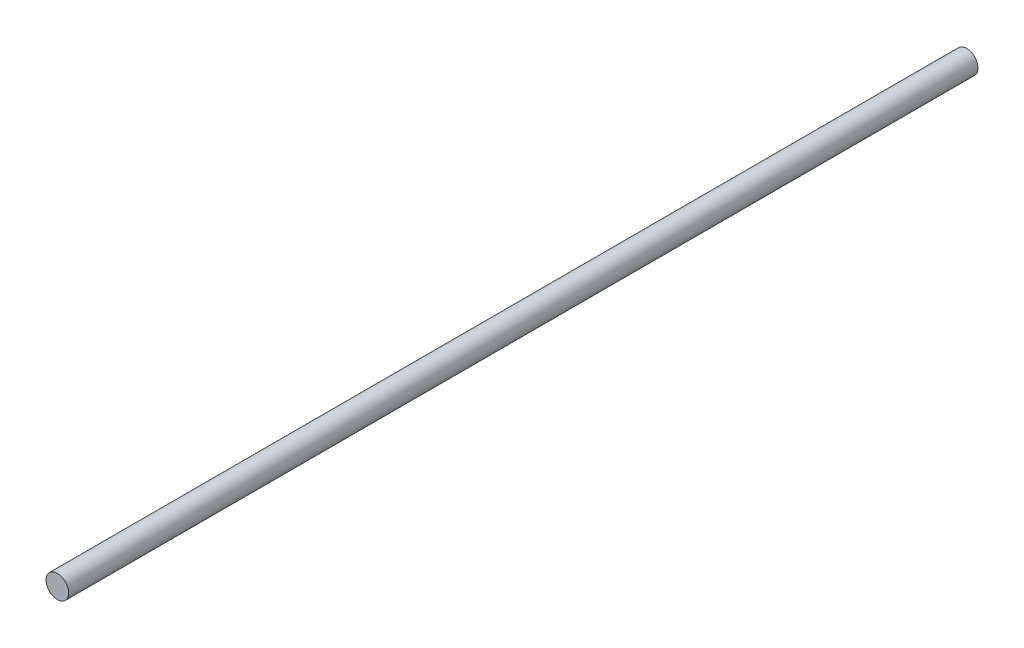
ISO-10303-21;
HEADER;
FILE_DESCRIPTION(('STEP AP214'),'2;1');
FILE_NAME('part.step','',(''),(''),'','','');
FILE_SCHEMA(('AUTOMOTIVE_DESIGN { 1 0 10303 214 1 1 1 1 }'));
ENDSEC;
DATA;
#1=APPLICATION_CONTEXT('core data for automotive mechanical design processes');
#2=APPLICATION_PROTOCOL_DEFINITION('international standard','automotive_design',2000,#1);
#3=PRODUCT_CONTEXT('',#1,'mechanical');
#4=PRODUCT('Part','Part','',(#3));
#5=PRODUCT_RELATED_PRODUCT_CATEGORY('part','',(#4));
#6=PRODUCT_DEFINITION_FORMATION('','',#4);
#7=PRODUCT_DEFINITION_CONTEXT('part definition',#1,'design');
#8=PRODUCT_DEFINITION('design','',#6,#7);
#9=PRODUCT_DEFINITION_SHAPE('','',#8);
#10=(LENGTH_UNIT() NAMED_UNIT(*) SI_UNIT(.MILLI.,.METRE.));
#11=(NAMED_UNIT(*) PLANE_ANGLE_UNIT() SI_UNIT($,.RADIAN.));
#12=(NAMED_UNIT(*) SI_UNIT($,.STERADIAN.) SOLID_ANGLE_UNIT());
#13=UNCERTAINTY_MEASURE_WITH_UNIT(LENGTH_MEASURE(1.E-05),#10,'distance_accuracy_value','');
#14=(GEOMETRIC_REPRESENTATION_CONTEXT(3) GLOBAL_UNCERTAINTY_ASSIGNED_CONTEXT((#13)) GLOBAL_UNIT_ASSIGNED_CONTEXT((#10,
#11,#12)) REPRESENTATION_CONTEXT('',''));
#15=CARTESIAN_POINT('',(0.,0.,0.));
#16=DIRECTION('',(0.,0.,1.));
#17=DIRECTION('',(1.,0.,0.));
#18=AXIS2_PLACEMENT_3D('',#15,#16,#17);
#19=CARTESIAN_POINT('',(0.,0.,40.));
#20=DIRECTION('',(0.,0.,-1.));
#21=DIRECTION('',(-1.,0.,0.));
#22=AXIS2_PLACEMENT_3D('',#19,#20,#21);
#23=CYLINDRICAL_SURFACE('',#22,0.5);
#24=CARTESIAN_POINT('',(0.,0.,40.));
#25=DIRECTION('',(0.,0.,1.));
#26=DIRECTION('',(1.,0.,0.));
#27=AXIS2_PLACEMENT_3D('',#24,#25,#26);
#28=CIRCLE('',#27,0.5);
#29=CARTESIAN_POINT('',(0.5,0.,40.));
#30=VERTEX_POINT('',#29);
#31=EDGE_CURVE('E10',#30,#30,#28,.T.);
#32=ORIENTED_EDGE('',*,*,#31,.F.);
#33=EDGE_LOOP('',(#32));
#34=FACE_BOUND('',#33,.T.);
#35=CARTESIAN_POINT('',(0.,0.,0.));
#36=DIRECTION('',(0.,0.,1.));
#37=DIRECTION('',(1.,0.,0.));
#38=AXIS2_PLACEMENT_3D('',#35,#36,#37);
#39=CIRCLE('',#38,0.5);
#40=CARTESIAN_POINT('',(0.5,0.,0.));
#41=VERTEX_POINT('',#40);
#42=EDGE_CURVE('E40',#41,#41,#39,.T.);
#43=ORIENTED_EDGE('',*,*,#42,.T.);
#44=EDGE_LOOP('',(#43));
#45=FACE_BOUND('',#44,.T.);
#46=ADVANCED_FACE('F37',(#34,#45),#23,.T.);
#47=CARTESIAN_POINT('',(0.,0.,40.));
#48=DIRECTION('',(0.,0.,1.));
#49=DIRECTION('',(1.,0.,0.));
#50=AXIS2_PLACEMENT_3D('',#47,#48,#49);
#51=PLANE('',#50);
#52=ORIENTED_EDGE('',*,*,#31,.T.);
#53=EDGE_LOOP('',(#52));
#54=FACE_BOUND('',#53,.T.);
#55=ADVANCED_FACE('F54',(#54),#51,.T.);
#56=CARTESIAN_POINT('',(0.,0.,0.));
#57=DIRECTION('',(0.,0.,1.));
#58=DIRECTION('',(1.,0.,0.));
#59=AXIS2_PLACEMENT_3D('',#56,#57,#58);
#60=PLANE('',#59);
#61=ORIENTED_EDGE('',*,*,#42,.F.);
#62=EDGE_LOOP('',(#61));
#63=FACE_BOUND('',#62,.T.);
#64=ADVANCED_FACE('F52',(#63),#60,.F.);
#65=CLOSED_SHELL('',(#46,#55,#64));
#66=MANIFOLD_SOLID_BREP('B2',#65);
#67=ADVANCED_BREP_SHAPE_REPRESENTATION('',(#18,#66),#14);
#68=SHAPE_DEFINITION_REPRESENTATION(#9,#67);
ENDSEC;
END-ISO-10303-21;
